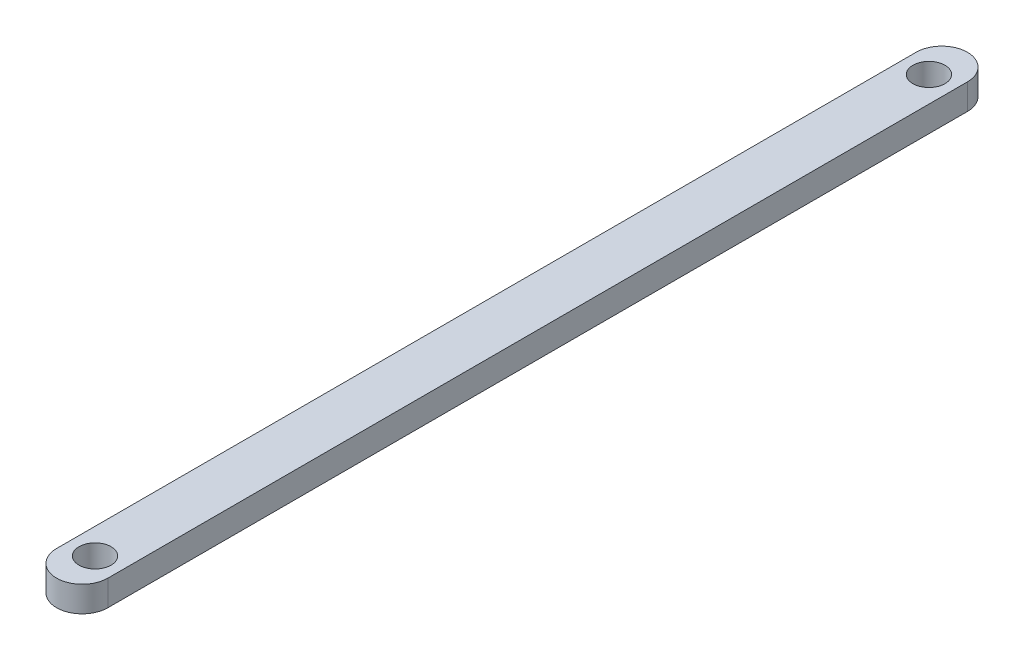
ISO-10303-21;
HEADER;
FILE_DESCRIPTION(('STEP AP214'),'2;1');
FILE_NAME('part.step','',(''),(''),'','','');
FILE_SCHEMA(('AUTOMOTIVE_DESIGN { 1 0 10303 214 1 1 1 1 }'));
ENDSEC;
DATA;
#1=APPLICATION_CONTEXT('core data for automotive mechanical design processes');
#2=APPLICATION_PROTOCOL_DEFINITION('international standard','automotive_design',2000,#1);
#3=PRODUCT_CONTEXT('',#1,'mechanical');
#4=PRODUCT('Part','Part','',(#3));
#5=PRODUCT_RELATED_PRODUCT_CATEGORY('part','',(#4));
#6=PRODUCT_DEFINITION_FORMATION('','',#4);
#7=PRODUCT_DEFINITION_CONTEXT('part definition',#1,'design');
#8=PRODUCT_DEFINITION('design','',#6,#7);
#9=PRODUCT_DEFINITION_SHAPE('','',#8);
#10=(LENGTH_UNIT() NAMED_UNIT(*) SI_UNIT(.MILLI.,.METRE.));
#11=(NAMED_UNIT(*) PLANE_ANGLE_UNIT() SI_UNIT($,.RADIAN.));
#12=(NAMED_UNIT(*) SI_UNIT($,.STERADIAN.) SOLID_ANGLE_UNIT());
#13=UNCERTAINTY_MEASURE_WITH_UNIT(LENGTH_MEASURE(1.E-05),#10,'distance_accuracy_value','');
#14=(GEOMETRIC_REPRESENTATION_CONTEXT(3) GLOBAL_UNCERTAINTY_ASSIGNED_CONTEXT((#13)) GLOBAL_UNIT_ASSIGNED_CONTEXT((#10,
#11,#12)) REPRESENTATION_CONTEXT('',''));
#15=CARTESIAN_POINT('',(0.,0.,0.));
#16=DIRECTION('',(0.,0.,1.));
#17=DIRECTION('',(1.,0.,0.));
#18=AXIS2_PLACEMENT_3D('',#15,#16,#17);
#19=CARTESIAN_POINT('',(0.499999999999994,1.,-33.5));
#20=DIRECTION('',(0.,1.,0.));
#21=DIRECTION('',(0.,0.,1.));
#22=AXIS2_PLACEMENT_3D('',#19,#20,#21);
#23=PLANE('',#22);
#24=CARTESIAN_POINT('',(0.499999999999994,1.,-32.5));
#25=DIRECTION('',(0.,1.,0.));
#26=DIRECTION('',(0.,0.,1.));
#27=AXIS2_PLACEMENT_3D('',#24,#25,#26);
#28=CIRCLE('',#27,1.25);
#29=CARTESIAN_POINT('',(0.499999999999994,1.,-31.25));
#30=VERTEX_POINT('',#29);
#31=EDGE_CURVE('E116',#30,#30,#28,.T.);
#32=ORIENTED_EDGE('',*,*,#31,.F.);
#33=EDGE_LOOP('',(#32));
#34=FACE_BOUND('',#33,.T.);
#35=CARTESIAN_POINT('',(0.499999999999994,1.,-33.5));
#36=DIRECTION('',(0.,1.,0.));
#37=DIRECTION('',(0.,0.,1.));
#38=AXIS2_PLACEMENT_3D('',#35,#36,#37);
#39=CIRCLE('',#38,2.);
#40=CARTESIAN_POINT('',(2.49999999999999,1.,-33.5));
#41=VERTEX_POINT('',#40);
#42=CARTESIAN_POINT('',(-1.50000000000001,1.,-33.5));
#43=VERTEX_POINT('',#42);
#44=EDGE_CURVE('E96',#41,#43,#39,.T.);
#45=ORIENTED_EDGE('',*,*,#44,.T.);
#46=DIRECTION('',(0.,0.,1.));
#47=VECTOR('',#46,1.);
#48=CARTESIAN_POINT('',(-1.50000000000001,1.,-33.5));
#49=LINE('',#48,#47);
#50=CARTESIAN_POINT('',(-1.5,1.,33.5));
#51=VERTEX_POINT('',#50);
#52=EDGE_CURVE('E91',#43,#51,#49,.T.);
#53=ORIENTED_EDGE('',*,*,#52,.T.);
#54=CARTESIAN_POINT('',(0.500000000000002,1.,33.5));
#55=DIRECTION('',(0.,1.,0.));
#56=DIRECTION('',(0.,0.,1.));
#57=AXIS2_PLACEMENT_3D('',#54,#55,#56);
#58=CIRCLE('',#57,2.);
#59=CARTESIAN_POINT('',(2.5,1.,33.5));
#60=VERTEX_POINT('',#59);
#61=EDGE_CURVE('E94',#51,#60,#58,.T.);
#62=ORIENTED_EDGE('',*,*,#61,.T.);
#63=DIRECTION('',(0.,0.,-1.));
#64=VECTOR('',#63,1.);
#65=CARTESIAN_POINT('',(2.49999999999999,1.,-33.5));
#66=LINE('',#65,#64);
#67=EDGE_CURVE('E61',#60,#41,#66,.T.);
#68=ORIENTED_EDGE('',*,*,#67,.T.);
#69=EDGE_LOOP('',(#45,#53,#62,#68));
#70=FACE_BOUND('',#69,.T.);
#71=CARTESIAN_POINT('',(0.500000000000002,1.,32.5));
#72=DIRECTION('',(0.,1.,0.));
#73=DIRECTION('',(0.,0.,1.));
#74=AXIS2_PLACEMENT_3D('',#71,#72,#73);
#75=CIRCLE('',#74,1.25);
#76=CARTESIAN_POINT('',(0.500000000000002,1.,33.75));
#77=VERTEX_POINT('',#76);
#78=EDGE_CURVE('E138',#77,#77,#75,.T.);
#79=ORIENTED_EDGE('',*,*,#78,.F.);
#80=EDGE_LOOP('',(#79));
#81=FACE_BOUND('',#80,.T.);
#82=ADVANCED_FACE('F43',(#34,#70,#81),#23,.T.);
#83=CARTESIAN_POINT('',(0.499999999999994,-1.,-33.5));
#84=DIRECTION('',(0.,1.,0.));
#85=DIRECTION('',(0.,0.,1.));
#86=AXIS2_PLACEMENT_3D('',#83,#84,#85);
#87=PLANE('',#86);
#88=CARTESIAN_POINT('',(0.499999999999994,-1.,-33.5));
#89=DIRECTION('',(0.,1.,0.));
#90=DIRECTION('',(0.,0.,1.));
#91=AXIS2_PLACEMENT_3D('',#88,#89,#90);
#92=CIRCLE('',#91,2.);
#93=CARTESIAN_POINT('',(2.49999999999999,-1.,-33.5));
#94=VERTEX_POINT('',#93);
#95=CARTESIAN_POINT('',(-1.50000000000001,-1.,-33.5));
#96=VERTEX_POINT('',#95);
#97=EDGE_CURVE('E112',#94,#96,#92,.T.);
#98=ORIENTED_EDGE('',*,*,#97,.F.);
#99=DIRECTION('',(0.,0.,-1.));
#100=VECTOR('',#99,1.);
#101=CARTESIAN_POINT('',(2.49999999999999,-1.,-33.5));
#102=LINE('',#101,#100);
#103=CARTESIAN_POINT('',(2.5,-1.,33.5));
#104=VERTEX_POINT('',#103);
#105=EDGE_CURVE('E84',#104,#94,#102,.T.);
#106=ORIENTED_EDGE('',*,*,#105,.F.);
#107=CARTESIAN_POINT('',(0.500000000000002,-1.,33.5));
#108=DIRECTION('',(0.,1.,0.));
#109=DIRECTION('',(0.,0.,1.));
#110=AXIS2_PLACEMENT_3D('',#107,#108,#109);
#111=CIRCLE('',#110,2.);
#112=CARTESIAN_POINT('',(-1.5,-1.,33.5));
#113=VERTEX_POINT('',#112);
#114=EDGE_CURVE('E78',#113,#104,#111,.T.);
#115=ORIENTED_EDGE('',*,*,#114,.F.);
#116=DIRECTION('',(0.,0.,1.));
#117=VECTOR('',#116,1.);
#118=CARTESIAN_POINT('',(-1.50000000000001,-1.,-33.5));
#119=LINE('',#118,#117);
#120=EDGE_CURVE('E101',#96,#113,#119,.T.);
#121=ORIENTED_EDGE('',*,*,#120,.F.);
#122=EDGE_LOOP('',(#98,#106,#115,#121));
#123=FACE_BOUND('',#122,.T.);
#124=CARTESIAN_POINT('',(0.499999999999994,-1.,-32.5));
#125=DIRECTION('',(0.,1.,0.));
#126=DIRECTION('',(0.,0.,1.));
#127=AXIS2_PLACEMENT_3D('',#124,#125,#126);
#128=CIRCLE('',#127,1.25);
#129=CARTESIAN_POINT('',(0.499999999999994,-1.,-31.25));
#130=VERTEX_POINT('',#129);
#131=EDGE_CURVE('E134',#130,#130,#128,.T.);
#132=ORIENTED_EDGE('',*,*,#131,.T.);
#133=EDGE_LOOP('',(#132));
#134=FACE_BOUND('',#133,.T.);
#135=CARTESIAN_POINT('',(0.500000000000002,-1.,32.5));
#136=DIRECTION('',(0.,1.,0.));
#137=DIRECTION('',(0.,0.,1.));
#138=AXIS2_PLACEMENT_3D('',#135,#136,#137);
#139=CIRCLE('',#138,1.25);
#140=CARTESIAN_POINT('',(0.500000000000002,-1.,33.75));
#141=VERTEX_POINT('',#140);
#142=EDGE_CURVE('E142',#141,#141,#139,.T.);
#143=ORIENTED_EDGE('',*,*,#142,.T.);
#144=EDGE_LOOP('',(#143));
#145=FACE_BOUND('',#144,.T.);
#146=ADVANCED_FACE('F129',(#123,#134,#145),#87,.F.);
#147=CARTESIAN_POINT('',(0.499999999999994,1.,-33.5));
#148=DIRECTION('',(0.,-1.,0.));
#149=DIRECTION('',(0.,0.,-1.));
#150=AXIS2_PLACEMENT_3D('',#147,#148,#149);
#151=CYLINDRICAL_SURFACE('',#150,2.);
#152=ORIENTED_EDGE('',*,*,#97,.T.);
#153=DIRECTION('',(0.,-1.,0.));
#154=VECTOR('',#153,1.);
#155=CARTESIAN_POINT('',(-1.50000000000001,1.,-33.5));
#156=LINE('',#155,#154);
#157=EDGE_CURVE('E11',#43,#96,#156,.T.);
#158=ORIENTED_EDGE('',*,*,#157,.F.);
#159=ORIENTED_EDGE('',*,*,#44,.F.);
#160=DIRECTION('',(0.,-1.,0.));
#161=VECTOR('',#160,1.);
#162=CARTESIAN_POINT('',(2.49999999999999,1.,-33.5));
#163=LINE('',#162,#161);
#164=EDGE_CURVE('E108',#41,#94,#163,.T.);
#165=ORIENTED_EDGE('',*,*,#164,.T.);
#166=EDGE_LOOP('',(#152,#158,#159,#165));
#167=FACE_BOUND('',#166,.T.);
#168=ADVANCED_FACE('F45',(#167),#151,.T.);
#169=CARTESIAN_POINT('',(-1.50000000000001,1.,-33.5));
#170=DIRECTION('',(1.,0.,0.));
#171=DIRECTION('',(0.,0.,-1.));
#172=AXIS2_PLACEMENT_3D('',#169,#170,#171);
#173=PLANE('',#172);
#174=ORIENTED_EDGE('',*,*,#120,.T.);
#175=DIRECTION('',(0.,-1.,0.));
#176=VECTOR('',#175,1.);
#177=CARTESIAN_POINT('',(-1.5,1.,33.5));
#178=LINE('',#177,#176);
#179=EDGE_CURVE('E53',#51,#113,#178,.T.);
#180=ORIENTED_EDGE('',*,*,#179,.F.);
#181=ORIENTED_EDGE('',*,*,#52,.F.);
#182=ORIENTED_EDGE('',*,*,#157,.T.);
#183=EDGE_LOOP('',(#174,#180,#181,#182));
#184=FACE_BOUND('',#183,.T.);
#185=ADVANCED_FACE('F100',(#184),#173,.F.);
#186=CARTESIAN_POINT('',(0.500000000000002,1.,33.5));
#187=DIRECTION('',(0.,-1.,0.));
#188=DIRECTION('',(0.,0.,-1.));
#189=AXIS2_PLACEMENT_3D('',#186,#187,#188);
#190=CYLINDRICAL_SURFACE('',#189,2.);
#191=ORIENTED_EDGE('',*,*,#114,.T.);
#192=DIRECTION('',(0.,-1.,0.));
#193=VECTOR('',#192,1.);
#194=CARTESIAN_POINT('',(2.5,1.,33.5));
#195=LINE('',#194,#193);
#196=EDGE_CURVE('E103',#60,#104,#195,.T.);
#197=ORIENTED_EDGE('',*,*,#196,.F.);
#198=ORIENTED_EDGE('',*,*,#61,.F.);
#199=ORIENTED_EDGE('',*,*,#179,.T.);
#200=EDGE_LOOP('',(#191,#197,#198,#199));
#201=FACE_BOUND('',#200,.T.);
#202=ADVANCED_FACE('F104',(#201),#190,.T.);
#203=CARTESIAN_POINT('',(2.49999999999999,1.,-33.5));
#204=DIRECTION('',(-1.,0.,0.));
#205=DIRECTION('',(0.,0.,1.));
#206=AXIS2_PLACEMENT_3D('',#203,#204,#205);
#207=PLANE('',#206);
#208=ORIENTED_EDGE('',*,*,#105,.T.);
#209=ORIENTED_EDGE('',*,*,#164,.F.);
#210=ORIENTED_EDGE('',*,*,#67,.F.);
#211=ORIENTED_EDGE('',*,*,#196,.T.);
#212=EDGE_LOOP('',(#208,#209,#210,#211));
#213=FACE_BOUND('',#212,.T.);
#214=ADVANCED_FACE('F126',(#213),#207,.F.);
#215=CARTESIAN_POINT('',(0.499999999999994,1.,-32.5));
#216=DIRECTION('',(0.,-1.,0.));
#217=DIRECTION('',(0.,0.,-1.));
#218=AXIS2_PLACEMENT_3D('',#215,#216,#217);
#219=CYLINDRICAL_SURFACE('',#218,1.25);
#220=ORIENTED_EDGE('',*,*,#31,.T.);
#221=EDGE_LOOP('',(#220));
#222=FACE_BOUND('',#221,.T.);
#223=ORIENTED_EDGE('',*,*,#131,.F.);
#224=EDGE_LOOP('',(#223));
#225=FACE_BOUND('',#224,.T.);
#226=ADVANCED_FACE('F161',(#222,#225),#219,.F.);
#227=CARTESIAN_POINT('',(0.500000000000002,1.,32.5));
#228=DIRECTION('',(0.,-1.,0.));
#229=DIRECTION('',(0.,0.,-1.));
#230=AXIS2_PLACEMENT_3D('',#227,#228,#229);
#231=CYLINDRICAL_SURFACE('',#230,1.25);
#232=ORIENTED_EDGE('',*,*,#78,.T.);
#233=EDGE_LOOP('',(#232));
#234=FACE_BOUND('',#233,.T.);
#235=ORIENTED_EDGE('',*,*,#142,.F.);
#236=EDGE_LOOP('',(#235));
#237=FACE_BOUND('',#236,.T.);
#238=ADVANCED_FACE('F150',(#234,#237),#231,.F.);
#239=CLOSED_SHELL('',(#82,#146,#168,#185,#202,#214,#226,#238));
#240=MANIFOLD_SOLID_BREP('B2',#239);
#241=ADVANCED_BREP_SHAPE_REPRESENTATION('',(#18,#240),#14);
#242=SHAPE_DEFINITION_REPRESENTATION(#9,#241);
ENDSEC;
END-ISO-10303-21;
